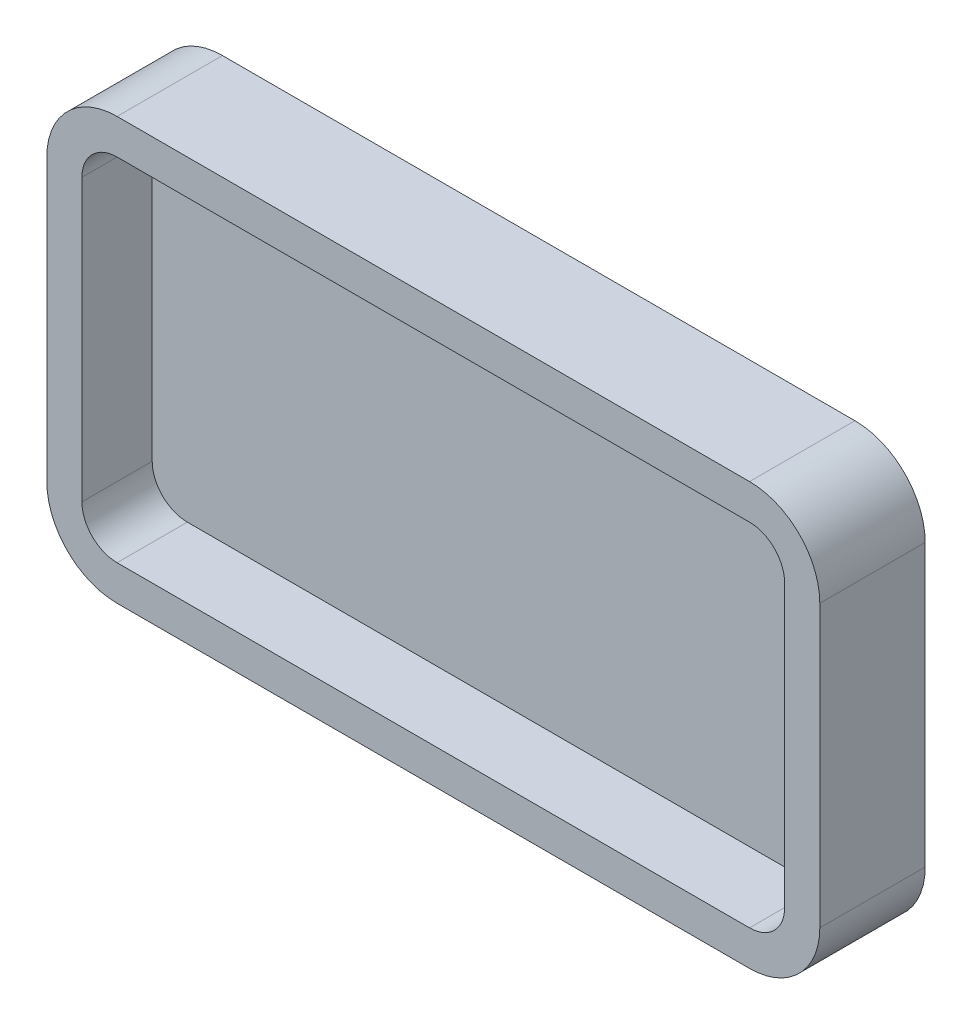
ISO-10303-21;
HEADER;
FILE_DESCRIPTION(('STEP AP214'),'2;1');
FILE_NAME('part.step','',(''),(''),'','','');
FILE_SCHEMA(('AUTOMOTIVE_DESIGN { 1 0 10303 214 1 1 1 1 }'));
ENDSEC;
DATA;
#1=APPLICATION_CONTEXT('core data for automotive mechanical design processes');
#2=APPLICATION_PROTOCOL_DEFINITION('international standard','automotive_design',2000,#1);
#3=PRODUCT_CONTEXT('',#1,'mechanical');
#4=PRODUCT('Part','Part','',(#3));
#5=PRODUCT_RELATED_PRODUCT_CATEGORY('part','',(#4));
#6=PRODUCT_DEFINITION_FORMATION('','',#4);
#7=PRODUCT_DEFINITION_CONTEXT('part definition',#1,'design');
#8=PRODUCT_DEFINITION('design','',#6,#7);
#9=PRODUCT_DEFINITION_SHAPE('','',#8);
#10=(LENGTH_UNIT() NAMED_UNIT(*) SI_UNIT(.MILLI.,.METRE.));
#11=(NAMED_UNIT(*) PLANE_ANGLE_UNIT() SI_UNIT($,.RADIAN.));
#12=(NAMED_UNIT(*) SI_UNIT($,.STERADIAN.) SOLID_ANGLE_UNIT());
#13=UNCERTAINTY_MEASURE_WITH_UNIT(LENGTH_MEASURE(1.E-05),#10,'distance_accuracy_value','');
#14=(GEOMETRIC_REPRESENTATION_CONTEXT(3) GLOBAL_UNCERTAINTY_ASSIGNED_CONTEXT((#13)) GLOBAL_UNIT_ASSIGNED_CONTEXT((#10,
#11,#12)) REPRESENTATION_CONTEXT('',''));
#15=CARTESIAN_POINT('',(0.,0.,0.));
#16=DIRECTION('',(0.,0.,1.));
#17=DIRECTION('',(1.,0.,0.));
#18=AXIS2_PLACEMENT_3D('',#15,#16,#17);
#19=CARTESIAN_POINT('',(95.,45.,15.));
#20=DIRECTION('',(0.,0.,-1.));
#21=DIRECTION('',(-1.,0.,0.));
#22=AXIS2_PLACEMENT_3D('',#19,#20,#21);
#23=CYLINDRICAL_SURFACE('',#22,5.);
#24=DIRECTION('',(0.,0.,-1.));
#25=VECTOR('',#24,1.);
#26=CARTESIAN_POINT('',(95.,50.,15.));
#27=LINE('',#26,#25);
#28=CARTESIAN_POINT('',(95.,50.,15.));
#29=VERTEX_POINT('',#28);
#30=CARTESIAN_POINT('',(95.,50.,5.));
#31=VERTEX_POINT('',#30);
#32=EDGE_CURVE('E215',#29,#31,#27,.T.);
#33=ORIENTED_EDGE('',*,*,#32,.T.);
#34=CARTESIAN_POINT('',(95.,45.,5.));
#35=DIRECTION('',(0.,0.,1.));
#36=DIRECTION('',(-1.,0.,0.));
#37=AXIS2_PLACEMENT_3D('',#34,#35,#36);
#38=CIRCLE('',#37,5.);
#39=CARTESIAN_POINT('',(100.,45.,5.));
#40=VERTEX_POINT('',#39);
#41=EDGE_CURVE('E199',#40,#31,#38,.T.);
#42=ORIENTED_EDGE('',*,*,#41,.F.);
#43=DIRECTION('',(0.,0.,-1.));
#44=VECTOR('',#43,1.);
#45=CARTESIAN_POINT('',(100.,45.,15.));
#46=LINE('',#45,#44);
#47=CARTESIAN_POINT('',(100.,45.,15.));
#48=VERTEX_POINT('',#47);
#49=EDGE_CURVE('E421',#48,#40,#46,.T.);
#50=ORIENTED_EDGE('',*,*,#49,.F.);
#51=CARTESIAN_POINT('',(95.,45.,15.));
#52=DIRECTION('',(0.,0.,1.));
#53=DIRECTION('',(-1.,0.,0.));
#54=AXIS2_PLACEMENT_3D('',#51,#52,#53);
#55=CIRCLE('',#54,5.);
#56=EDGE_CURVE('E223',#48,#29,#55,.T.);
#57=ORIENTED_EDGE('',*,*,#56,.T.);
#58=EDGE_LOOP('',(#33,#42,#50,#57));
#59=FACE_BOUND('',#58,.T.);
#60=ADVANCED_FACE('F87',(#59),#23,.F.);
#61=CARTESIAN_POINT('',(5.00000000000004,50.,15.));
#62=DIRECTION('',(0.,-1.,0.));
#63=DIRECTION('',(0.,0.,-1.));
#64=AXIS2_PLACEMENT_3D('',#61,#62,#63);
#65=PLANE('',#64);
#66=DIRECTION('',(0.,0.,-1.));
#67=VECTOR('',#66,1.);
#68=CARTESIAN_POINT('',(5.00000000000004,50.,15.));
#69=LINE('',#68,#67);
#70=CARTESIAN_POINT('',(5.00000000000004,50.,15.));
#71=VERTEX_POINT('',#70);
#72=CARTESIAN_POINT('',(5.00000000000004,50.,5.));
#73=VERTEX_POINT('',#72);
#74=EDGE_CURVE('E218',#71,#73,#69,.T.);
#75=ORIENTED_EDGE('',*,*,#74,.T.);
#76=DIRECTION('',(-1.,0.,0.));
#77=VECTOR('',#76,1.);
#78=CARTESIAN_POINT('',(5.00000000000004,50.,5.));
#79=LINE('',#78,#77);
#80=EDGE_CURVE('E202',#31,#73,#79,.T.);
#81=ORIENTED_EDGE('',*,*,#80,.F.);
#82=ORIENTED_EDGE('',*,*,#32,.F.);
#83=DIRECTION('',(-1.,0.,0.));
#84=VECTOR('',#83,1.);
#85=CARTESIAN_POINT('',(5.00000000000004,50.,15.));
#86=LINE('',#85,#84);
#87=EDGE_CURVE('E441',#29,#71,#86,.T.);
#88=ORIENTED_EDGE('',*,*,#87,.T.);
#89=EDGE_LOOP('',(#75,#81,#82,#88));
#90=FACE_BOUND('',#89,.T.);
#91=ADVANCED_FACE('F214',(#90),#65,.T.);
#92=CARTESIAN_POINT('',(5.,45.,15.));
#93=DIRECTION('',(0.,0.,-1.));
#94=DIRECTION('',(-1.,0.,0.));
#95=AXIS2_PLACEMENT_3D('',#92,#93,#94);
#96=CYLINDRICAL_SURFACE('',#95,5.);
#97=DIRECTION('',(0.,0.,-1.));
#98=VECTOR('',#97,1.);
#99=CARTESIAN_POINT('',(0.,45.,15.));
#100=LINE('',#99,#98);
#101=CARTESIAN_POINT('',(0.,45.,15.));
#102=VERTEX_POINT('',#101);
#103=CARTESIAN_POINT('',(0.,45.,5.));
#104=VERTEX_POINT('',#103);
#105=EDGE_CURVE('E232',#102,#104,#100,.T.);
#106=ORIENTED_EDGE('',*,*,#105,.T.);
#107=CARTESIAN_POINT('',(5.,45.,5.));
#108=DIRECTION('',(0.,0.,1.));
#109=DIRECTION('',(1.,0.,0.));
#110=AXIS2_PLACEMENT_3D('',#107,#108,#109);
#111=CIRCLE('',#110,5.);
#112=EDGE_CURVE('E220',#73,#104,#111,.T.);
#113=ORIENTED_EDGE('',*,*,#112,.F.);
#114=ORIENTED_EDGE('',*,*,#74,.F.);
#115=CARTESIAN_POINT('',(5.,45.,15.));
#116=DIRECTION('',(0.,0.,1.));
#117=DIRECTION('',(-1.,0.,0.));
#118=AXIS2_PLACEMENT_3D('',#115,#116,#117);
#119=CIRCLE('',#118,5.);
#120=EDGE_CURVE('E402',#71,#102,#119,.T.);
#121=ORIENTED_EDGE('',*,*,#120,.T.);
#122=EDGE_LOOP('',(#106,#113,#114,#121));
#123=FACE_BOUND('',#122,.T.);
#124=ADVANCED_FACE('F361',(#123),#96,.F.);
#125=CARTESIAN_POINT('',(0.,5.00000000000004,15.));
#126=DIRECTION('',(1.,0.,0.));
#127=DIRECTION('',(0.,0.,-1.));
#128=AXIS2_PLACEMENT_3D('',#125,#126,#127);
#129=PLANE('',#128);
#130=DIRECTION('',(0.,0.,-1.));
#131=VECTOR('',#130,1.);
#132=CARTESIAN_POINT('',(0.,5.00000000000004,15.));
#133=LINE('',#132,#131);
#134=CARTESIAN_POINT('',(0.,5.00000000000004,15.));
#135=VERTEX_POINT('',#134);
#136=CARTESIAN_POINT('',(0.,5.00000000000004,5.));
#137=VERTEX_POINT('',#136);
#138=EDGE_CURVE('E406',#135,#137,#133,.T.);
#139=ORIENTED_EDGE('',*,*,#138,.T.);
#140=DIRECTION('',(0.,-1.,0.));
#141=VECTOR('',#140,1.);
#142=CARTESIAN_POINT('',(0.,45.,5.));
#143=LINE('',#142,#141);
#144=EDGE_CURVE('E456',#104,#137,#143,.T.);
#145=ORIENTED_EDGE('',*,*,#144,.F.);
#146=ORIENTED_EDGE('',*,*,#105,.F.);
#147=DIRECTION('',(0.,-1.,0.));
#148=VECTOR('',#147,1.);
#149=CARTESIAN_POINT('',(0.,5.00000000000004,15.));
#150=LINE('',#149,#148);
#151=EDGE_CURVE('E436',#102,#135,#150,.T.);
#152=ORIENTED_EDGE('',*,*,#151,.T.);
#153=EDGE_LOOP('',(#139,#145,#146,#152));
#154=FACE_BOUND('',#153,.T.);
#155=ADVANCED_FACE('F391',(#154),#129,.T.);
#156=CARTESIAN_POINT('',(5.,5.,15.));
#157=DIRECTION('',(0.,0.,-1.));
#158=DIRECTION('',(-1.,0.,0.));
#159=AXIS2_PLACEMENT_3D('',#156,#157,#158);
#160=CYLINDRICAL_SURFACE('',#159,5.);
#161=DIRECTION('',(0.,0.,-1.));
#162=VECTOR('',#161,1.);
#163=CARTESIAN_POINT('',(5.00000000000004,0.,15.));
#164=LINE('',#163,#162);
#165=CARTESIAN_POINT('',(5.00000000000004,0.,15.));
#166=VERTEX_POINT('',#165);
#167=CARTESIAN_POINT('',(5.00000000000004,0.,5.));
#168=VERTEX_POINT('',#167);
#169=EDGE_CURVE('E409',#166,#168,#164,.T.);
#170=ORIENTED_EDGE('',*,*,#169,.T.);
#171=CARTESIAN_POINT('',(5.,5.,5.));
#172=DIRECTION('',(0.,0.,1.));
#173=DIRECTION('',(1.,0.,0.));
#174=AXIS2_PLACEMENT_3D('',#171,#172,#173);
#175=CIRCLE('',#174,5.);
#176=EDGE_CURVE('E453',#137,#168,#175,.T.);
#177=ORIENTED_EDGE('',*,*,#176,.F.);
#178=ORIENTED_EDGE('',*,*,#138,.F.);
#179=CARTESIAN_POINT('',(5.,5.,15.));
#180=DIRECTION('',(0.,0.,1.));
#181=DIRECTION('',(-1.,0.,0.));
#182=AXIS2_PLACEMENT_3D('',#179,#180,#181);
#183=CIRCLE('',#182,5.);
#184=EDGE_CURVE('E433',#135,#166,#183,.T.);
#185=ORIENTED_EDGE('',*,*,#184,.T.);
#186=EDGE_LOOP('',(#170,#177,#178,#185));
#187=FACE_BOUND('',#186,.T.);
#188=ADVANCED_FACE('F387',(#187),#160,.F.);
#189=CARTESIAN_POINT('',(5.00000000000004,0.,15.));
#190=DIRECTION('',(0.,1.,0.));
#191=DIRECTION('',(0.,0.,1.));
#192=AXIS2_PLACEMENT_3D('',#189,#190,#191);
#193=PLANE('',#192);
#194=DIRECTION('',(0.,0.,-1.));
#195=VECTOR('',#194,1.);
#196=CARTESIAN_POINT('',(95.,0.,15.));
#197=LINE('',#196,#195);
#198=CARTESIAN_POINT('',(95.,0.,15.));
#199=VERTEX_POINT('',#198);
#200=CARTESIAN_POINT('',(95.,0.,5.));
#201=VERTEX_POINT('',#200);
#202=EDGE_CURVE('E415',#199,#201,#197,.T.);
#203=ORIENTED_EDGE('',*,*,#202,.T.);
#204=DIRECTION('',(1.,0.,0.));
#205=VECTOR('',#204,1.);
#206=CARTESIAN_POINT('',(5.00000000000004,0.,5.));
#207=LINE('',#206,#205);
#208=EDGE_CURVE('E450',#168,#201,#207,.T.);
#209=ORIENTED_EDGE('',*,*,#208,.F.);
#210=ORIENTED_EDGE('',*,*,#169,.F.);
#211=DIRECTION('',(1.,0.,0.));
#212=VECTOR('',#211,1.);
#213=CARTESIAN_POINT('',(5.00000000000004,0.,15.));
#214=LINE('',#213,#212);
#215=EDGE_CURVE('E430',#166,#199,#214,.T.);
#216=ORIENTED_EDGE('',*,*,#215,.T.);
#217=EDGE_LOOP('',(#203,#209,#210,#216));
#218=FACE_BOUND('',#217,.T.);
#219=ADVANCED_FACE('F383',(#218),#193,.T.);
#220=CARTESIAN_POINT('',(95.,5.,15.));
#221=DIRECTION('',(0.,0.,-1.));
#222=DIRECTION('',(-1.,0.,0.));
#223=AXIS2_PLACEMENT_3D('',#220,#221,#222);
#224=CYLINDRICAL_SURFACE('',#223,5.);
#225=DIRECTION('',(0.,0.,-1.));
#226=VECTOR('',#225,1.);
#227=CARTESIAN_POINT('',(100.,5.,15.));
#228=LINE('',#227,#226);
#229=CARTESIAN_POINT('',(100.,5.,15.));
#230=VERTEX_POINT('',#229);
#231=CARTESIAN_POINT('',(100.,5.,5.));
#232=VERTEX_POINT('',#231);
#233=EDGE_CURVE('E110',#230,#232,#228,.T.);
#234=ORIENTED_EDGE('',*,*,#233,.T.);
#235=CARTESIAN_POINT('',(95.,5.,5.));
#236=DIRECTION('',(0.,0.,1.));
#237=DIRECTION('',(1.,0.,0.));
#238=AXIS2_PLACEMENT_3D('',#235,#236,#237);
#239=CIRCLE('',#238,5.);
#240=EDGE_CURVE('E103',#201,#232,#239,.T.);
#241=ORIENTED_EDGE('',*,*,#240,.F.);
#242=ORIENTED_EDGE('',*,*,#202,.F.);
#243=CARTESIAN_POINT('',(95.,5.,15.));
#244=DIRECTION('',(0.,0.,1.));
#245=DIRECTION('',(1.,0.,0.));
#246=AXIS2_PLACEMENT_3D('',#243,#244,#245);
#247=CIRCLE('',#246,5.);
#248=EDGE_CURVE('E427',#199,#230,#247,.T.);
#249=ORIENTED_EDGE('',*,*,#248,.T.);
#250=EDGE_LOOP('',(#234,#241,#242,#249));
#251=FACE_BOUND('',#250,.T.);
#252=ADVANCED_FACE('F380',(#251),#224,.F.);
#253=CARTESIAN_POINT('',(100.,5.00000000000004,15.));
#254=DIRECTION('',(-1.,0.,0.));
#255=DIRECTION('',(0.,0.,1.));
#256=AXIS2_PLACEMENT_3D('',#253,#254,#255);
#257=PLANE('',#256);
#258=ORIENTED_EDGE('',*,*,#49,.T.);
#259=DIRECTION('',(0.,1.,0.));
#260=VECTOR('',#259,1.);
#261=CARTESIAN_POINT('',(100.,45.,5.));
#262=LINE('',#261,#260);
#263=EDGE_CURVE('E204',#232,#40,#262,.T.);
#264=ORIENTED_EDGE('',*,*,#263,.F.);
#265=ORIENTED_EDGE('',*,*,#233,.F.);
#266=DIRECTION('',(0.,1.,0.));
#267=VECTOR('',#266,1.);
#268=CARTESIAN_POINT('',(100.,5.00000000000004,15.));
#269=LINE('',#268,#267);
#270=EDGE_CURVE('E424',#230,#48,#269,.T.);
#271=ORIENTED_EDGE('',*,*,#270,.T.);
#272=EDGE_LOOP('',(#258,#264,#265,#271));
#273=FACE_BOUND('',#272,.T.);
#274=ADVANCED_FACE('F367',(#273),#257,.T.);
#275=CARTESIAN_POINT('',(95.,45.,15.));
#276=DIRECTION('',(0.,0.,-1.));
#277=DIRECTION('',(-1.,0.,0.));
#278=AXIS2_PLACEMENT_3D('',#275,#276,#277);
#279=PLANE('',#278);
#280=CARTESIAN_POINT('',(95.,45.,15.));
#281=DIRECTION('',(0.,0.,-1.));
#282=DIRECTION('',(-1.,0.,0.));
#283=AXIS2_PLACEMENT_3D('',#280,#281,#282);
#284=CIRCLE('',#283,10.);
#285=CARTESIAN_POINT('',(105.,45.,15.));
#286=VERTEX_POINT('',#285);
#287=CARTESIAN_POINT('',(95.,55.,15.));
#288=VERTEX_POINT('',#287);
#289=EDGE_CURVE('E236',#286,#288,#284,.F.);
#290=ORIENTED_EDGE('',*,*,#289,.T.);
#291=DIRECTION('',(-1.,0.,0.));
#292=VECTOR('',#291,1.);
#293=CARTESIAN_POINT('',(95.,55.,15.));
#294=LINE('',#293,#292);
#295=CARTESIAN_POINT('',(5.00000000000004,55.,15.));
#296=VERTEX_POINT('',#295);
#297=EDGE_CURVE('E240',#288,#296,#294,.T.);
#298=ORIENTED_EDGE('',*,*,#297,.T.);
#299=CARTESIAN_POINT('',(5.,45.,15.));
#300=DIRECTION('',(0.,0.,-1.));
#301=DIRECTION('',(-1.,0.,0.));
#302=AXIS2_PLACEMENT_3D('',#299,#300,#301);
#303=CIRCLE('',#302,10.);
#304=CARTESIAN_POINT('',(-5.,44.9999999999999,15.));
#305=VERTEX_POINT('',#304);
#306=EDGE_CURVE('E244',#296,#305,#303,.F.);
#307=ORIENTED_EDGE('',*,*,#306,.T.);
#308=DIRECTION('',(0.,-1.,0.));
#309=VECTOR('',#308,1.);
#310=CARTESIAN_POINT('',(-5.,45.,15.));
#311=LINE('',#310,#309);
#312=CARTESIAN_POINT('',(-5.,5.00000000000004,15.));
#313=VERTEX_POINT('',#312);
#314=EDGE_CURVE('E247',#305,#313,#311,.T.);
#315=ORIENTED_EDGE('',*,*,#314,.T.);
#316=CARTESIAN_POINT('',(5.,5.,15.));
#317=DIRECTION('',(0.,0.,-1.));
#318=DIRECTION('',(-1.,0.,0.));
#319=AXIS2_PLACEMENT_3D('',#316,#317,#318);
#320=CIRCLE('',#319,10.);
#321=CARTESIAN_POINT('',(5.00000000000007,-5.,15.));
#322=VERTEX_POINT('',#321);
#323=EDGE_CURVE('E250',#313,#322,#320,.F.);
#324=ORIENTED_EDGE('',*,*,#323,.T.);
#325=DIRECTION('',(1.,0.,0.));
#326=VECTOR('',#325,1.);
#327=CARTESIAN_POINT('',(95.,-5.,15.));
#328=LINE('',#327,#326);
#329=CARTESIAN_POINT('',(95.,-5.,15.));
#330=VERTEX_POINT('',#329);
#331=EDGE_CURVE('E253',#322,#330,#328,.T.);
#332=ORIENTED_EDGE('',*,*,#331,.T.);
#333=CARTESIAN_POINT('',(95.,5.,15.));
#334=DIRECTION('',(0.,0.,-1.));
#335=DIRECTION('',(-1.,0.,0.));
#336=AXIS2_PLACEMENT_3D('',#333,#334,#335);
#337=CIRCLE('',#336,10.);
#338=CARTESIAN_POINT('',(105.,5.,15.));
#339=VERTEX_POINT('',#338);
#340=EDGE_CURVE('E256',#330,#339,#337,.F.);
#341=ORIENTED_EDGE('',*,*,#340,.T.);
#342=DIRECTION('',(0.,1.,0.));
#343=VECTOR('',#342,1.);
#344=CARTESIAN_POINT('',(105.,45.,15.));
#345=LINE('',#344,#343);
#346=EDGE_CURVE('E259',#339,#286,#345,.T.);
#347=ORIENTED_EDGE('',*,*,#346,.T.);
#348=EDGE_LOOP('',(#290,#298,#307,#315,#324,#332,#341,#347));
#349=FACE_BOUND('',#348,.T.);
#350=ORIENTED_EDGE('',*,*,#56,.F.);
#351=ORIENTED_EDGE('',*,*,#270,.F.);
#352=ORIENTED_EDGE('',*,*,#248,.F.);
#353=ORIENTED_EDGE('',*,*,#215,.F.);
#354=ORIENTED_EDGE('',*,*,#184,.F.);
#355=ORIENTED_EDGE('',*,*,#151,.F.);
#356=ORIENTED_EDGE('',*,*,#120,.F.);
#357=ORIENTED_EDGE('',*,*,#87,.F.);
#358=EDGE_LOOP('',(#350,#351,#352,#353,#354,#355,#356,#357));
#359=FACE_BOUND('',#358,.T.);
#360=ADVANCED_FACE('F329',(#349,#359),#279,.F.);
#361=CARTESIAN_POINT('',(95.,45.,0.));
#362=DIRECTION('',(0.,0.,-1.));
#363=DIRECTION('',(-1.,0.,0.));
#364=AXIS2_PLACEMENT_3D('',#361,#362,#363);
#365=PLANE('',#364);
#366=CARTESIAN_POINT('',(95.,45.,0.));
#367=DIRECTION('',(0.,0.,-1.));
#368=DIRECTION('',(-1.,0.,0.));
#369=AXIS2_PLACEMENT_3D('',#366,#367,#368);
#370=CIRCLE('',#369,10.);
#371=CARTESIAN_POINT('',(105.,45.,0.));
#372=VERTEX_POINT('',#371);
#373=CARTESIAN_POINT('',(95.,55.,0.));
#374=VERTEX_POINT('',#373);
#375=EDGE_CURVE('E225',#372,#374,#370,.F.);
#376=ORIENTED_EDGE('',*,*,#375,.F.);
#377=DIRECTION('',(0.,1.,0.));
#378=VECTOR('',#377,1.);
#379=CARTESIAN_POINT('',(105.,45.,0.));
#380=LINE('',#379,#378);
#381=CARTESIAN_POINT('',(105.,5.,0.));
#382=VERTEX_POINT('',#381);
#383=EDGE_CURVE('E241',#382,#372,#380,.T.);
#384=ORIENTED_EDGE('',*,*,#383,.F.);
#385=CARTESIAN_POINT('',(95.,5.,0.));
#386=DIRECTION('',(0.,0.,-1.));
#387=DIRECTION('',(-1.,0.,0.));
#388=AXIS2_PLACEMENT_3D('',#385,#386,#387);
#389=CIRCLE('',#388,10.);
#390=CARTESIAN_POINT('',(95.,-5.,0.));
#391=VERTEX_POINT('',#390);
#392=EDGE_CURVE('E277',#391,#382,#389,.F.);
#393=ORIENTED_EDGE('',*,*,#392,.F.);
#394=DIRECTION('',(1.,0.,0.));
#395=VECTOR('',#394,1.);
#396=CARTESIAN_POINT('',(95.,-5.,0.));
#397=LINE('',#396,#395);
#398=CARTESIAN_POINT('',(5.00000000000007,-5.,0.));
#399=VERTEX_POINT('',#398);
#400=EDGE_CURVE('E274',#399,#391,#397,.T.);
#401=ORIENTED_EDGE('',*,*,#400,.F.);
#402=CARTESIAN_POINT('',(5.,5.,0.));
#403=DIRECTION('',(0.,0.,-1.));
#404=DIRECTION('',(-1.,0.,0.));
#405=AXIS2_PLACEMENT_3D('',#402,#403,#404);
#406=CIRCLE('',#405,10.);
#407=CARTESIAN_POINT('',(-5.,5.00000000000004,0.));
#408=VERTEX_POINT('',#407);
#409=EDGE_CURVE('E271',#408,#399,#406,.F.);
#410=ORIENTED_EDGE('',*,*,#409,.F.);
#411=DIRECTION('',(0.,-1.,0.));
#412=VECTOR('',#411,1.);
#413=CARTESIAN_POINT('',(-5.,45.,0.));
#414=LINE('',#413,#412);
#415=CARTESIAN_POINT('',(-5.,44.9999999999999,0.));
#416=VERTEX_POINT('',#415);
#417=EDGE_CURVE('E268',#416,#408,#414,.T.);
#418=ORIENTED_EDGE('',*,*,#417,.F.);
#419=CARTESIAN_POINT('',(5.,45.,0.));
#420=DIRECTION('',(0.,0.,-1.));
#421=DIRECTION('',(-1.,0.,0.));
#422=AXIS2_PLACEMENT_3D('',#419,#420,#421);
#423=CIRCLE('',#422,10.);
#424=CARTESIAN_POINT('',(5.00000000000004,55.,0.));
#425=VERTEX_POINT('',#424);
#426=EDGE_CURVE('E265',#425,#416,#423,.F.);
#427=ORIENTED_EDGE('',*,*,#426,.F.);
#428=DIRECTION('',(-1.,0.,0.));
#429=VECTOR('',#428,1.);
#430=CARTESIAN_POINT('',(95.,55.,0.));
#431=LINE('',#430,#429);
#432=EDGE_CURVE('E230',#374,#425,#431,.T.);
#433=ORIENTED_EDGE('',*,*,#432,.F.);
#434=EDGE_LOOP('',(#376,#384,#393,#401,#410,#418,#427,#433));
#435=FACE_BOUND('',#434,.T.);
#436=ADVANCED_FACE('F316',(#435),#365,.T.);
#437=CARTESIAN_POINT('',(95.,45.,15.));
#438=DIRECTION('',(0.,0.,-1.));
#439=DIRECTION('',(-1.,0.,0.));
#440=AXIS2_PLACEMENT_3D('',#437,#438,#439);
#441=CYLINDRICAL_SURFACE('',#440,10.);
#442=ORIENTED_EDGE('',*,*,#375,.T.);
#443=DIRECTION('',(0.,0.,-1.));
#444=VECTOR('',#443,1.);
#445=CARTESIAN_POINT('',(95.,55.,15.));
#446=LINE('',#445,#444);
#447=EDGE_CURVE('E12',#288,#374,#446,.T.);
#448=ORIENTED_EDGE('',*,*,#447,.F.);
#449=ORIENTED_EDGE('',*,*,#289,.F.);
#450=DIRECTION('',(0.,0.,-1.));
#451=VECTOR('',#450,1.);
#452=CARTESIAN_POINT('',(105.,45.,15.));
#453=LINE('',#452,#451);
#454=EDGE_CURVE('E261',#286,#372,#453,.T.);
#455=ORIENTED_EDGE('',*,*,#454,.T.);
#456=EDGE_LOOP('',(#442,#448,#449,#455));
#457=FACE_BOUND('',#456,.T.);
#458=ADVANCED_FACE('F89',(#457),#441,.T.);
#459=CARTESIAN_POINT('',(95.,55.,15.));
#460=DIRECTION('',(0.,-1.,0.));
#461=DIRECTION('',(0.,0.,-1.));
#462=AXIS2_PLACEMENT_3D('',#459,#460,#461);
#463=PLANE('',#462);
#464=ORIENTED_EDGE('',*,*,#432,.T.);
#465=DIRECTION('',(0.,0.,-1.));
#466=VECTOR('',#465,1.);
#467=CARTESIAN_POINT('',(5.00000000000004,55.,15.));
#468=LINE('',#467,#466);
#469=EDGE_CURVE('E96',#296,#425,#468,.T.);
#470=ORIENTED_EDGE('',*,*,#469,.F.);
#471=ORIENTED_EDGE('',*,*,#297,.F.);
#472=ORIENTED_EDGE('',*,*,#447,.T.);
#473=EDGE_LOOP('',(#464,#470,#471,#472));
#474=FACE_BOUND('',#473,.T.);
#475=ADVANCED_FACE('F334',(#474),#463,.F.);
#476=CARTESIAN_POINT('',(5.,45.,15.));
#477=DIRECTION('',(0.,0.,-1.));
#478=DIRECTION('',(-1.,0.,0.));
#479=AXIS2_PLACEMENT_3D('',#476,#477,#478);
#480=CYLINDRICAL_SURFACE('',#479,10.);
#481=ORIENTED_EDGE('',*,*,#426,.T.);
#482=DIRECTION('',(0.,0.,-1.));
#483=VECTOR('',#482,1.);
#484=CARTESIAN_POINT('',(-5.,44.9999999999999,15.));
#485=LINE('',#484,#483);
#486=EDGE_CURVE('E301',#305,#416,#485,.T.);
#487=ORIENTED_EDGE('',*,*,#486,.F.);
#488=ORIENTED_EDGE('',*,*,#306,.F.);
#489=ORIENTED_EDGE('',*,*,#469,.T.);
#490=EDGE_LOOP('',(#481,#487,#488,#489));
#491=FACE_BOUND('',#490,.T.);
#492=ADVANCED_FACE('F310',(#491),#480,.T.);
#493=CARTESIAN_POINT('',(-5.,45.,15.));
#494=DIRECTION('',(1.,0.,0.));
#495=DIRECTION('',(0.,0.,-1.));
#496=AXIS2_PLACEMENT_3D('',#493,#494,#495);
#497=PLANE('',#496);
#498=ORIENTED_EDGE('',*,*,#417,.T.);
#499=DIRECTION('',(0.,0.,-1.));
#500=VECTOR('',#499,1.);
#501=CARTESIAN_POINT('',(-5.,5.00000000000004,15.));
#502=LINE('',#501,#500);
#503=EDGE_CURVE('E297',#313,#408,#502,.T.);
#504=ORIENTED_EDGE('',*,*,#503,.F.);
#505=ORIENTED_EDGE('',*,*,#314,.F.);
#506=ORIENTED_EDGE('',*,*,#486,.T.);
#507=EDGE_LOOP('',(#498,#504,#505,#506));
#508=FACE_BOUND('',#507,.T.);
#509=ADVANCED_FACE('F321',(#508),#497,.F.);
#510=CARTESIAN_POINT('',(5.,5.,15.));
#511=DIRECTION('',(0.,0.,-1.));
#512=DIRECTION('',(-1.,0.,0.));
#513=AXIS2_PLACEMENT_3D('',#510,#511,#512);
#514=CYLINDRICAL_SURFACE('',#513,10.);
#515=ORIENTED_EDGE('',*,*,#409,.T.);
#516=DIRECTION('',(0.,0.,-1.));
#517=VECTOR('',#516,1.);
#518=CARTESIAN_POINT('',(5.00000000000007,-5.,15.));
#519=LINE('',#518,#517);
#520=EDGE_CURVE('E293',#322,#399,#519,.T.);
#521=ORIENTED_EDGE('',*,*,#520,.F.);
#522=ORIENTED_EDGE('',*,*,#323,.F.);
#523=ORIENTED_EDGE('',*,*,#503,.T.);
#524=EDGE_LOOP('',(#515,#521,#522,#523));
#525=FACE_BOUND('',#524,.T.);
#526=ADVANCED_FACE('F325',(#525),#514,.T.);
#527=CARTESIAN_POINT('',(95.,-5.,15.));
#528=DIRECTION('',(0.,1.,0.));
#529=DIRECTION('',(0.,0.,1.));
#530=AXIS2_PLACEMENT_3D('',#527,#528,#529);
#531=PLANE('',#530);
#532=ORIENTED_EDGE('',*,*,#400,.T.);
#533=DIRECTION('',(0.,0.,-1.));
#534=VECTOR('',#533,1.);
#535=CARTESIAN_POINT('',(95.,-5.,15.));
#536=LINE('',#535,#534);
#537=EDGE_CURVE('E289',#330,#391,#536,.T.);
#538=ORIENTED_EDGE('',*,*,#537,.F.);
#539=ORIENTED_EDGE('',*,*,#331,.F.);
#540=ORIENTED_EDGE('',*,*,#520,.T.);
#541=EDGE_LOOP('',(#532,#538,#539,#540));
#542=FACE_BOUND('',#541,.T.);
#543=ADVANCED_FACE('F347',(#542),#531,.F.);
#544=CARTESIAN_POINT('',(95.,5.,15.));
#545=DIRECTION('',(0.,0.,-1.));
#546=DIRECTION('',(-1.,0.,0.));
#547=AXIS2_PLACEMENT_3D('',#544,#545,#546);
#548=CYLINDRICAL_SURFACE('',#547,10.);
#549=ORIENTED_EDGE('',*,*,#392,.T.);
#550=DIRECTION('',(0.,0.,-1.));
#551=VECTOR('',#550,1.);
#552=CARTESIAN_POINT('',(105.,5.,15.));
#553=LINE('',#552,#551);
#554=EDGE_CURVE('E285',#339,#382,#553,.T.);
#555=ORIENTED_EDGE('',*,*,#554,.F.);
#556=ORIENTED_EDGE('',*,*,#340,.F.);
#557=ORIENTED_EDGE('',*,*,#537,.T.);
#558=EDGE_LOOP('',(#549,#555,#556,#557));
#559=FACE_BOUND('',#558,.T.);
#560=ADVANCED_FACE('F345',(#559),#548,.T.);
#561=CARTESIAN_POINT('',(105.,45.,15.));
#562=DIRECTION('',(-1.,0.,0.));
#563=DIRECTION('',(0.,0.,1.));
#564=AXIS2_PLACEMENT_3D('',#561,#562,#563);
#565=PLANE('',#564);
#566=ORIENTED_EDGE('',*,*,#383,.T.);
#567=ORIENTED_EDGE('',*,*,#454,.F.);
#568=ORIENTED_EDGE('',*,*,#346,.F.);
#569=ORIENTED_EDGE('',*,*,#554,.T.);
#570=EDGE_LOOP('',(#566,#567,#568,#569));
#571=FACE_BOUND('',#570,.T.);
#572=ADVANCED_FACE('F340',(#571),#565,.F.);
#573=CARTESIAN_POINT('',(95.,45.,5.));
#574=DIRECTION('',(0.,0.,-1.));
#575=DIRECTION('',(-1.,0.,0.));
#576=AXIS2_PLACEMENT_3D('',#573,#574,#575);
#577=PLANE('',#576);
#578=ORIENTED_EDGE('',*,*,#41,.T.);
#579=ORIENTED_EDGE('',*,*,#80,.T.);
#580=ORIENTED_EDGE('',*,*,#112,.T.);
#581=ORIENTED_EDGE('',*,*,#144,.T.);
#582=ORIENTED_EDGE('',*,*,#176,.T.);
#583=ORIENTED_EDGE('',*,*,#208,.T.);
#584=ORIENTED_EDGE('',*,*,#240,.T.);
#585=ORIENTED_EDGE('',*,*,#263,.T.);
#586=EDGE_LOOP('',(#578,#579,#580,#581,#582,#583,#584,#585));
#587=FACE_BOUND('',#586,.T.);
#588=ADVANCED_FACE('F201',(#587),#577,.F.);
#589=CLOSED_SHELL('',(#60,#91,#124,#155,#188,#219,#252,#274,#360,#436,#458,#475,#492,#509,#526,
#543,#560,#572,#588));
#590=MANIFOLD_SOLID_BREP('B2',#589);
#591=ADVANCED_BREP_SHAPE_REPRESENTATION('',(#18,#590),#14);
#592=SHAPE_DEFINITION_REPRESENTATION(#9,#591);
ENDSEC;
END-ISO-10303-21;
